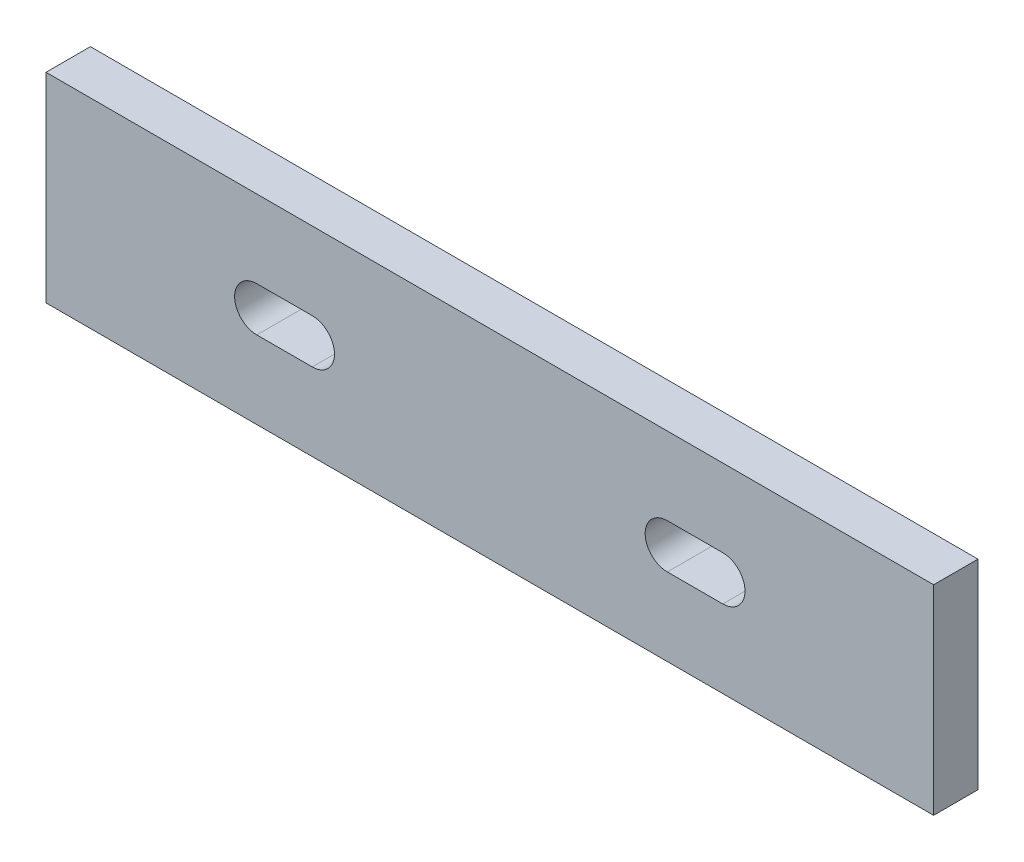
ISO-10303-21;
HEADER;
FILE_DESCRIPTION(('STEP AP214'),'2;1');
FILE_NAME('part.step','',(''),(''),'','','');
FILE_SCHEMA(('AUTOMOTIVE_DESIGN { 1 0 10303 214 1 1 1 1 }'));
ENDSEC;
DATA;
#1=APPLICATION_CONTEXT('core data for automotive mechanical design processes');
#2=APPLICATION_PROTOCOL_DEFINITION('international standard','automotive_design',2000,#1);
#3=PRODUCT_CONTEXT('',#1,'mechanical');
#4=PRODUCT('Part','Part','',(#3));
#5=PRODUCT_RELATED_PRODUCT_CATEGORY('part','',(#4));
#6=PRODUCT_DEFINITION_FORMATION('','',#4);
#7=PRODUCT_DEFINITION_CONTEXT('part definition',#1,'design');
#8=PRODUCT_DEFINITION('design','',#6,#7);
#9=PRODUCT_DEFINITION_SHAPE('','',#8);
#10=(LENGTH_UNIT() NAMED_UNIT(*) SI_UNIT(.MILLI.,.METRE.));
#11=(NAMED_UNIT(*) PLANE_ANGLE_UNIT() SI_UNIT($,.RADIAN.));
#12=(NAMED_UNIT(*) SI_UNIT($,.STERADIAN.) SOLID_ANGLE_UNIT());
#13=UNCERTAINTY_MEASURE_WITH_UNIT(LENGTH_MEASURE(1.E-05),#10,'distance_accuracy_value','');
#14=(GEOMETRIC_REPRESENTATION_CONTEXT(3) GLOBAL_UNCERTAINTY_ASSIGNED_CONTEXT((#13)) GLOBAL_UNIT_ASSIGNED_CONTEXT((#10,
#11,#12)) REPRESENTATION_CONTEXT('',''));
#15=CARTESIAN_POINT('',(0.,0.,0.));
#16=DIRECTION('',(0.,0.,1.));
#17=DIRECTION('',(1.,0.,0.));
#18=AXIS2_PLACEMENT_3D('',#15,#16,#17);
#19=CARTESIAN_POINT('',(0.,0.,20.));
#20=DIRECTION('',(0.,0.,-1.));
#21=DIRECTION('',(-1.,0.,0.));
#22=AXIS2_PLACEMENT_3D('',#19,#20,#21);
#23=PLANE('',#22);
#24=CARTESIAN_POINT('',(107.508250825083,-33.8778877887789,20.));
#25=DIRECTION('',(0.,0.,1.));
#26=DIRECTION('',(1.,0.,0.));
#27=AXIS2_PLACEMENT_3D('',#24,#25,#26);
#28=CIRCLE('',#27,10.);
#29=CARTESIAN_POINT('',(107.508250825083,-43.8778877887789,20.));
#30=VERTEX_POINT('',#29);
#31=CARTESIAN_POINT('',(107.508250825083,-23.8778877887789,20.));
#32=VERTEX_POINT('',#31);
#33=EDGE_CURVE('E159',#30,#32,#28,.T.);
#34=ORIENTED_EDGE('',*,*,#33,.F.);
#35=DIRECTION('',(1.,0.,0.));
#36=VECTOR('',#35,1.);
#37=CARTESIAN_POINT('',(107.508250825083,-43.8778877887789,20.));
#38=LINE('',#37,#36);
#39=CARTESIAN_POINT('',(82.5082508250826,-43.8778877887789,20.));
#40=VERTEX_POINT('',#39);
#41=EDGE_CURVE('E167',#40,#30,#38,.T.);
#42=ORIENTED_EDGE('',*,*,#41,.F.);
#43=CARTESIAN_POINT('',(82.5082508250826,-33.8778877887789,20.));
#44=DIRECTION('',(0.,0.,1.));
#45=DIRECTION('',(1.,0.,0.));
#46=AXIS2_PLACEMENT_3D('',#43,#44,#45);
#47=CIRCLE('',#46,10.);
#48=CARTESIAN_POINT('',(82.5082508250826,-23.8778877887789,20.));
#49=VERTEX_POINT('',#48);
#50=EDGE_CURVE('E164',#49,#40,#47,.T.);
#51=ORIENTED_EDGE('',*,*,#50,.F.);
#52=DIRECTION('',(-1.,0.,0.));
#53=VECTOR('',#52,1.);
#54=CARTESIAN_POINT('',(107.508250825083,-23.8778877887789,20.));
#55=LINE('',#54,#53);
#56=EDGE_CURVE('E161',#32,#49,#55,.T.);
#57=ORIENTED_EDGE('',*,*,#56,.F.);
#58=EDGE_LOOP('',(#34,#42,#51,#57));
#59=FACE_BOUND('',#58,.T.);
#60=DIRECTION('',(0.,1.,0.));
#61=VECTOR('',#60,1.);
#62=CARTESIAN_POINT('',(202.508250825083,11.1221122112211,20.));
#63=LINE('',#62,#61);
#64=CARTESIAN_POINT('',(202.508250825083,-78.8778877887789,20.));
#65=VERTEX_POINT('',#64);
#66=CARTESIAN_POINT('',(202.508250825083,11.1221122112211,20.));
#67=VERTEX_POINT('',#66);
#68=EDGE_CURVE('E190',#65,#67,#63,.T.);
#69=ORIENTED_EDGE('',*,*,#68,.T.);
#70=DIRECTION('',(-1.,0.,0.));
#71=VECTOR('',#70,1.);
#72=CARTESIAN_POINT('',(202.508250825083,11.1221122112211,20.));
#73=LINE('',#72,#71);
#74=CARTESIAN_POINT('',(-197.491749174917,11.122112211221,20.));
#75=VERTEX_POINT('',#74);
#76=EDGE_CURVE('E193',#67,#75,#73,.T.);
#77=ORIENTED_EDGE('',*,*,#76,.T.);
#78=DIRECTION('',(0.,-1.,0.));
#79=VECTOR('',#78,1.);
#80=CARTESIAN_POINT('',(-197.491749174917,11.122112211221,20.));
#81=LINE('',#80,#79);
#82=CARTESIAN_POINT('',(-197.491749174917,-78.8778877887789,20.));
#83=VERTEX_POINT('',#82);
#84=EDGE_CURVE('E196',#75,#83,#81,.T.);
#85=ORIENTED_EDGE('',*,*,#84,.T.);
#86=DIRECTION('',(1.,0.,0.));
#87=VECTOR('',#86,1.);
#88=CARTESIAN_POINT('',(202.508250825083,-78.8778877887789,20.));
#89=LINE('',#88,#87);
#90=EDGE_CURVE('E198',#83,#65,#89,.T.);
#91=ORIENTED_EDGE('',*,*,#90,.T.);
#92=EDGE_LOOP('',(#69,#77,#85,#91));
#93=FACE_BOUND('',#92,.T.);
#94=CARTESIAN_POINT('',(-77.4917491749174,-33.8778877887789,20.));
#95=DIRECTION('',(0.,0.,1.));
#96=DIRECTION('',(1.,0.,0.));
#97=AXIS2_PLACEMENT_3D('',#94,#95,#96);
#98=CIRCLE('',#97,10.);
#99=CARTESIAN_POINT('',(-77.4917491749174,-43.8778877887789,20.));
#100=VERTEX_POINT('',#99);
#101=CARTESIAN_POINT('',(-77.4917491749174,-23.8778877887789,20.));
#102=VERTEX_POINT('',#101);
#103=EDGE_CURVE('E123',#100,#102,#98,.T.);
#104=ORIENTED_EDGE('',*,*,#103,.F.);
#105=DIRECTION('',(1.,0.,0.));
#106=VECTOR('',#105,1.);
#107=CARTESIAN_POINT('',(-77.4917491749174,-43.8778877887789,20.));
#108=LINE('',#107,#106);
#109=CARTESIAN_POINT('',(-102.491749174917,-43.8778877887789,20.));
#110=VERTEX_POINT('',#109);
#111=EDGE_CURVE('E145',#110,#100,#108,.T.);
#112=ORIENTED_EDGE('',*,*,#111,.F.);
#113=CARTESIAN_POINT('',(-102.491749174917,-33.8778877887789,20.));
#114=DIRECTION('',(0.,0.,1.));
#115=DIRECTION('',(1.,0.,0.));
#116=AXIS2_PLACEMENT_3D('',#113,#114,#115);
#117=CIRCLE('',#116,9.99999999999999);
#118=CARTESIAN_POINT('',(-102.491749174917,-23.8778877887789,20.));
#119=VERTEX_POINT('',#118);
#120=EDGE_CURVE('E143',#119,#110,#117,.T.);
#121=ORIENTED_EDGE('',*,*,#120,.F.);
#122=DIRECTION('',(-1.,0.,0.));
#123=VECTOR('',#122,1.);
#124=CARTESIAN_POINT('',(-77.4917491749174,-23.8778877887789,20.));
#125=LINE('',#124,#123);
#126=EDGE_CURVE('E131',#102,#119,#125,.T.);
#127=ORIENTED_EDGE('',*,*,#126,.F.);
#128=EDGE_LOOP('',(#104,#112,#121,#127));
#129=FACE_BOUND('',#128,.T.);
#130=ADVANCED_FACE('F34',(#59,#93,#129),#23,.F.);
#131=CARTESIAN_POINT('',(0.,0.,0.));
#132=DIRECTION('',(0.,0.,-1.));
#133=DIRECTION('',(-1.,0.,0.));
#134=AXIS2_PLACEMENT_3D('',#131,#132,#133);
#135=PLANE('',#134);
#136=DIRECTION('',(0.,1.,0.));
#137=VECTOR('',#136,1.);
#138=CARTESIAN_POINT('',(202.508250825083,11.1221122112211,0.));
#139=LINE('',#138,#137);
#140=CARTESIAN_POINT('',(202.508250825083,-78.8778877887789,0.));
#141=VERTEX_POINT('',#140);
#142=CARTESIAN_POINT('',(202.508250825083,11.1221122112211,0.));
#143=VERTEX_POINT('',#142);
#144=EDGE_CURVE('E189',#141,#143,#139,.T.);
#145=ORIENTED_EDGE('',*,*,#144,.F.);
#146=DIRECTION('',(1.,0.,0.));
#147=VECTOR('',#146,1.);
#148=CARTESIAN_POINT('',(202.508250825083,-78.8778877887789,0.));
#149=LINE('',#148,#147);
#150=CARTESIAN_POINT('',(-197.491749174917,-78.8778877887789,0.));
#151=VERTEX_POINT('',#150);
#152=EDGE_CURVE('E194',#151,#141,#149,.T.);
#153=ORIENTED_EDGE('',*,*,#152,.F.);
#154=DIRECTION('',(0.,-1.,0.));
#155=VECTOR('',#154,1.);
#156=CARTESIAN_POINT('',(-197.491749174917,11.122112211221,0.));
#157=LINE('',#156,#155);
#158=CARTESIAN_POINT('',(-197.491749174917,11.122112211221,0.));
#159=VERTEX_POINT('',#158);
#160=EDGE_CURVE('E205',#159,#151,#157,.T.);
#161=ORIENTED_EDGE('',*,*,#160,.F.);
#162=DIRECTION('',(-1.,0.,0.));
#163=VECTOR('',#162,1.);
#164=CARTESIAN_POINT('',(202.508250825083,11.1221122112211,0.));
#165=LINE('',#164,#163);
#166=EDGE_CURVE('E203',#143,#159,#165,.T.);
#167=ORIENTED_EDGE('',*,*,#166,.F.);
#168=EDGE_LOOP('',(#145,#153,#161,#167));
#169=FACE_BOUND('',#168,.T.);
#170=DIRECTION('',(1.,0.,0.));
#171=VECTOR('',#170,1.);
#172=CARTESIAN_POINT('',(107.508250825083,-43.8778877887789,0.));
#173=LINE('',#172,#171);
#174=CARTESIAN_POINT('',(82.5082508250826,-43.8778877887789,0.));
#175=VERTEX_POINT('',#174);
#176=CARTESIAN_POINT('',(107.508250825083,-43.8778877887789,0.));
#177=VERTEX_POINT('',#176);
#178=EDGE_CURVE('E162',#175,#177,#173,.T.);
#179=ORIENTED_EDGE('',*,*,#178,.T.);
#180=CARTESIAN_POINT('',(107.508250825083,-33.8778877887789,0.));
#181=DIRECTION('',(0.,0.,1.));
#182=DIRECTION('',(1.,0.,0.));
#183=AXIS2_PLACEMENT_3D('',#180,#181,#182);
#184=CIRCLE('',#183,10.);
#185=CARTESIAN_POINT('',(107.508250825083,-23.8778877887789,0.));
#186=VERTEX_POINT('',#185);
#187=EDGE_CURVE('E139',#177,#186,#184,.T.);
#188=ORIENTED_EDGE('',*,*,#187,.T.);
#189=DIRECTION('',(-1.,0.,0.));
#190=VECTOR('',#189,1.);
#191=CARTESIAN_POINT('',(107.508250825083,-23.8778877887789,0.));
#192=LINE('',#191,#190);
#193=CARTESIAN_POINT('',(82.5082508250826,-23.8778877887789,0.));
#194=VERTEX_POINT('',#193);
#195=EDGE_CURVE('E172',#186,#194,#192,.T.);
#196=ORIENTED_EDGE('',*,*,#195,.T.);
#197=CARTESIAN_POINT('',(82.5082508250826,-33.8778877887789,0.));
#198=DIRECTION('',(0.,0.,1.));
#199=DIRECTION('',(1.,0.,0.));
#200=AXIS2_PLACEMENT_3D('',#197,#198,#199);
#201=CIRCLE('',#200,10.);
#202=EDGE_CURVE('E175',#194,#175,#201,.T.);
#203=ORIENTED_EDGE('',*,*,#202,.T.);
#204=EDGE_LOOP('',(#179,#188,#196,#203));
#205=FACE_BOUND('',#204,.T.);
#206=DIRECTION('',(1.,0.,0.));
#207=VECTOR('',#206,1.);
#208=CARTESIAN_POINT('',(-77.4917491749174,-43.8778877887789,0.));
#209=LINE('',#208,#207);
#210=CARTESIAN_POINT('',(-102.491749174917,-43.8778877887789,0.));
#211=VERTEX_POINT('',#210);
#212=CARTESIAN_POINT('',(-77.4917491749174,-43.8778877887789,0.));
#213=VERTEX_POINT('',#212);
#214=EDGE_CURVE('E132',#211,#213,#209,.T.);
#215=ORIENTED_EDGE('',*,*,#214,.T.);
#216=CARTESIAN_POINT('',(-77.4917491749174,-33.8778877887789,0.));
#217=DIRECTION('',(0.,0.,1.));
#218=DIRECTION('',(1.,0.,0.));
#219=AXIS2_PLACEMENT_3D('',#216,#217,#218);
#220=CIRCLE('',#219,10.);
#221=CARTESIAN_POINT('',(-77.4917491749174,-23.8778877887789,0.));
#222=VERTEX_POINT('',#221);
#223=EDGE_CURVE('E57',#213,#222,#220,.T.);
#224=ORIENTED_EDGE('',*,*,#223,.T.);
#225=DIRECTION('',(-1.,0.,0.));
#226=VECTOR('',#225,1.);
#227=CARTESIAN_POINT('',(-77.4917491749174,-23.8778877887789,0.));
#228=LINE('',#227,#226);
#229=CARTESIAN_POINT('',(-102.491749174917,-23.8778877887789,0.));
#230=VERTEX_POINT('',#229);
#231=EDGE_CURVE('E138',#222,#230,#228,.T.);
#232=ORIENTED_EDGE('',*,*,#231,.T.);
#233=CARTESIAN_POINT('',(-102.491749174917,-33.8778877887789,0.));
#234=DIRECTION('',(0.,0.,1.));
#235=DIRECTION('',(1.,0.,0.));
#236=AXIS2_PLACEMENT_3D('',#233,#234,#235);
#237=CIRCLE('',#236,9.99999999999999);
#238=EDGE_CURVE('E151',#230,#211,#237,.T.);
#239=ORIENTED_EDGE('',*,*,#238,.T.);
#240=EDGE_LOOP('',(#215,#224,#232,#239));
#241=FACE_BOUND('',#240,.T.);
#242=ADVANCED_FACE('F223',(#169,#205,#241),#135,.T.);
#243=CARTESIAN_POINT('',(202.508250825083,11.1221122112211,20.));
#244=DIRECTION('',(-1.,0.,0.));
#245=DIRECTION('',(0.,0.,1.));
#246=AXIS2_PLACEMENT_3D('',#243,#244,#245);
#247=PLANE('',#246);
#248=ORIENTED_EDGE('',*,*,#144,.T.);
#249=DIRECTION('',(0.,0.,-1.));
#250=VECTOR('',#249,1.);
#251=CARTESIAN_POINT('',(202.508250825083,11.1221122112211,20.));
#252=LINE('',#251,#250);
#253=EDGE_CURVE('E11',#67,#143,#252,.T.);
#254=ORIENTED_EDGE('',*,*,#253,.F.);
#255=ORIENTED_EDGE('',*,*,#68,.F.);
#256=DIRECTION('',(0.,0.,-1.));
#257=VECTOR('',#256,1.);
#258=CARTESIAN_POINT('',(202.508250825083,-78.8778877887789,20.));
#259=LINE('',#258,#257);
#260=EDGE_CURVE('E200',#65,#141,#259,.T.);
#261=ORIENTED_EDGE('',*,*,#260,.T.);
#262=EDGE_LOOP('',(#248,#254,#255,#261));
#263=FACE_BOUND('',#262,.T.);
#264=ADVANCED_FACE('F36',(#263),#247,.F.);
#265=CARTESIAN_POINT('',(202.508250825083,11.1221122112211,20.));
#266=DIRECTION('',(0.,-1.,0.));
#267=DIRECTION('',(1.,0.,0.));
#268=AXIS2_PLACEMENT_3D('',#265,#266,#267);
#269=PLANE('',#268);
#270=ORIENTED_EDGE('',*,*,#166,.T.);
#271=DIRECTION('',(0.,0.,-1.));
#272=VECTOR('',#271,1.);
#273=CARTESIAN_POINT('',(-197.491749174917,11.122112211221,20.));
#274=LINE('',#273,#272);
#275=EDGE_CURVE('E42',#75,#159,#274,.T.);
#276=ORIENTED_EDGE('',*,*,#275,.F.);
#277=ORIENTED_EDGE('',*,*,#76,.F.);
#278=ORIENTED_EDGE('',*,*,#253,.T.);
#279=EDGE_LOOP('',(#270,#276,#277,#278));
#280=FACE_BOUND('',#279,.T.);
#281=ADVANCED_FACE('F233',(#280),#269,.F.);
#282=CARTESIAN_POINT('',(-197.491749174917,11.122112211221,20.));
#283=DIRECTION('',(1.,0.,0.));
#284=DIRECTION('',(0.,1.,0.));
#285=AXIS2_PLACEMENT_3D('',#282,#283,#284);
#286=PLANE('',#285);
#287=ORIENTED_EDGE('',*,*,#160,.T.);
#288=DIRECTION('',(0.,0.,-1.));
#289=VECTOR('',#288,1.);
#290=CARTESIAN_POINT('',(-197.491749174917,-78.8778877887789,20.));
#291=LINE('',#290,#289);
#292=EDGE_CURVE('E210',#83,#151,#291,.T.);
#293=ORIENTED_EDGE('',*,*,#292,.F.);
#294=ORIENTED_EDGE('',*,*,#84,.F.);
#295=ORIENTED_EDGE('',*,*,#275,.T.);
#296=EDGE_LOOP('',(#287,#293,#294,#295));
#297=FACE_BOUND('',#296,.T.);
#298=ADVANCED_FACE('F217',(#297),#286,.F.);
#299=CARTESIAN_POINT('',(202.508250825083,-78.8778877887789,20.));
#300=DIRECTION('',(0.,1.,0.));
#301=DIRECTION('',(-1.,0.,0.));
#302=AXIS2_PLACEMENT_3D('',#299,#300,#301);
#303=PLANE('',#302);
#304=ORIENTED_EDGE('',*,*,#152,.T.);
#305=ORIENTED_EDGE('',*,*,#260,.F.);
#306=ORIENTED_EDGE('',*,*,#90,.F.);
#307=ORIENTED_EDGE('',*,*,#292,.T.);
#308=EDGE_LOOP('',(#304,#305,#306,#307));
#309=FACE_BOUND('',#308,.T.);
#310=ADVANCED_FACE('F227',(#309),#303,.F.);
#311=CARTESIAN_POINT('',(107.508250825083,-33.8778877887789,20.));
#312=DIRECTION('',(0.,0.,-1.));
#313=DIRECTION('',(-1.,0.,0.));
#314=AXIS2_PLACEMENT_3D('',#311,#312,#313);
#315=CYLINDRICAL_SURFACE('',#314,10.);
#316=ORIENTED_EDGE('',*,*,#187,.F.);
#317=DIRECTION('',(0.,0.,-1.));
#318=VECTOR('',#317,1.);
#319=CARTESIAN_POINT('',(107.508250825083,-43.8778877887789,20.));
#320=LINE('',#319,#318);
#321=EDGE_CURVE('E169',#30,#177,#320,.T.);
#322=ORIENTED_EDGE('',*,*,#321,.F.);
#323=ORIENTED_EDGE('',*,*,#33,.T.);
#324=DIRECTION('',(0.,0.,-1.));
#325=VECTOR('',#324,1.);
#326=CARTESIAN_POINT('',(107.508250825083,-23.8778877887789,20.));
#327=LINE('',#326,#325);
#328=EDGE_CURVE('E186',#32,#186,#327,.T.);
#329=ORIENTED_EDGE('',*,*,#328,.T.);
#330=EDGE_LOOP('',(#316,#322,#323,#329));
#331=FACE_BOUND('',#330,.T.);
#332=ADVANCED_FACE('F249',(#331),#315,.F.);
#333=CARTESIAN_POINT('',(107.508250825083,-23.8778877887789,20.));
#334=DIRECTION('',(0.,-1.,0.));
#335=DIRECTION('',(1.,0.,0.));
#336=AXIS2_PLACEMENT_3D('',#333,#334,#335);
#337=PLANE('',#336);
#338=ORIENTED_EDGE('',*,*,#195,.F.);
#339=ORIENTED_EDGE('',*,*,#328,.F.);
#340=ORIENTED_EDGE('',*,*,#56,.T.);
#341=DIRECTION('',(0.,0.,-1.));
#342=VECTOR('',#341,1.);
#343=CARTESIAN_POINT('',(82.5082508250826,-23.8778877887789,20.));
#344=LINE('',#343,#342);
#345=EDGE_CURVE('E184',#49,#194,#344,.T.);
#346=ORIENTED_EDGE('',*,*,#345,.T.);
#347=EDGE_LOOP('',(#338,#339,#340,#346));
#348=FACE_BOUND('',#347,.T.);
#349=ADVANCED_FACE('F256',(#348),#337,.T.);
#350=CARTESIAN_POINT('',(82.5082508250826,-33.8778877887789,20.));
#351=DIRECTION('',(0.,0.,-1.));
#352=DIRECTION('',(-1.,0.,0.));
#353=AXIS2_PLACEMENT_3D('',#350,#351,#352);
#354=CYLINDRICAL_SURFACE('',#353,10.);
#355=ORIENTED_EDGE('',*,*,#202,.F.);
#356=ORIENTED_EDGE('',*,*,#345,.F.);
#357=ORIENTED_EDGE('',*,*,#50,.T.);
#358=DIRECTION('',(0.,0.,-1.));
#359=VECTOR('',#358,1.);
#360=CARTESIAN_POINT('',(82.5082508250826,-43.8778877887789,20.));
#361=LINE('',#360,#359);
#362=EDGE_CURVE('E182',#40,#175,#361,.T.);
#363=ORIENTED_EDGE('',*,*,#362,.T.);
#364=EDGE_LOOP('',(#355,#356,#357,#363));
#365=FACE_BOUND('',#364,.T.);
#366=ADVANCED_FACE('F261',(#365),#354,.F.);
#367=CARTESIAN_POINT('',(107.508250825083,-43.8778877887789,20.));
#368=DIRECTION('',(0.,1.,0.));
#369=DIRECTION('',(-1.,0.,0.));
#370=AXIS2_PLACEMENT_3D('',#367,#368,#369);
#371=PLANE('',#370);
#372=ORIENTED_EDGE('',*,*,#178,.F.);
#373=ORIENTED_EDGE('',*,*,#362,.F.);
#374=ORIENTED_EDGE('',*,*,#41,.T.);
#375=ORIENTED_EDGE('',*,*,#321,.T.);
#376=EDGE_LOOP('',(#372,#373,#374,#375));
#377=FACE_BOUND('',#376,.T.);
#378=ADVANCED_FACE('F267',(#377),#371,.T.);
#379=CARTESIAN_POINT('',(-77.4917491749174,-33.8778877887789,20.));
#380=DIRECTION('',(0.,0.,-1.));
#381=DIRECTION('',(-1.,0.,0.));
#382=AXIS2_PLACEMENT_3D('',#379,#380,#381);
#383=CYLINDRICAL_SURFACE('',#382,10.);
#384=ORIENTED_EDGE('',*,*,#223,.F.);
#385=DIRECTION('',(0.,0.,-1.));
#386=VECTOR('',#385,1.);
#387=CARTESIAN_POINT('',(-77.4917491749174,-43.8778877887789,20.));
#388=LINE('',#387,#386);
#389=EDGE_CURVE('E127',#100,#213,#388,.T.);
#390=ORIENTED_EDGE('',*,*,#389,.F.);
#391=ORIENTED_EDGE('',*,*,#103,.T.);
#392=DIRECTION('',(0.,0.,-1.));
#393=VECTOR('',#392,1.);
#394=CARTESIAN_POINT('',(-77.4917491749174,-23.8778877887789,20.));
#395=LINE('',#394,#393);
#396=EDGE_CURVE('E126',#102,#222,#395,.T.);
#397=ORIENTED_EDGE('',*,*,#396,.T.);
#398=EDGE_LOOP('',(#384,#390,#391,#397));
#399=FACE_BOUND('',#398,.T.);
#400=ADVANCED_FACE('F125',(#399),#383,.F.);
#401=CARTESIAN_POINT('',(-77.4917491749174,-23.8778877887789,20.));
#402=DIRECTION('',(0.,-1.,0.));
#403=DIRECTION('',(1.,0.,0.));
#404=AXIS2_PLACEMENT_3D('',#401,#402,#403);
#405=PLANE('',#404);
#406=ORIENTED_EDGE('',*,*,#231,.F.);
#407=ORIENTED_EDGE('',*,*,#396,.F.);
#408=ORIENTED_EDGE('',*,*,#126,.T.);
#409=DIRECTION('',(0.,0.,-1.));
#410=VECTOR('',#409,1.);
#411=CARTESIAN_POINT('',(-102.491749174917,-23.8778877887789,20.));
#412=LINE('',#411,#410);
#413=EDGE_CURVE('E140',#119,#230,#412,.T.);
#414=ORIENTED_EDGE('',*,*,#413,.T.);
#415=EDGE_LOOP('',(#406,#407,#408,#414));
#416=FACE_BOUND('',#415,.T.);
#417=ADVANCED_FACE('F135',(#416),#405,.T.);
#418=CARTESIAN_POINT('',(-102.491749174917,-33.8778877887789,20.));
#419=DIRECTION('',(0.,0.,-1.));
#420=DIRECTION('',(-1.,0.,0.));
#421=AXIS2_PLACEMENT_3D('',#418,#419,#420);
#422=CYLINDRICAL_SURFACE('',#421,9.99999999999999);
#423=ORIENTED_EDGE('',*,*,#238,.F.);
#424=ORIENTED_EDGE('',*,*,#413,.F.);
#425=ORIENTED_EDGE('',*,*,#120,.T.);
#426=DIRECTION('',(0.,0.,-1.));
#427=VECTOR('',#426,1.);
#428=CARTESIAN_POINT('',(-102.491749174917,-43.8778877887789,20.));
#429=LINE('',#428,#427);
#430=EDGE_CURVE('E49',#110,#211,#429,.T.);
#431=ORIENTED_EDGE('',*,*,#430,.T.);
#432=EDGE_LOOP('',(#423,#424,#425,#431));
#433=FACE_BOUND('',#432,.T.);
#434=ADVANCED_FACE('F286',(#433),#422,.F.);
#435=CARTESIAN_POINT('',(-77.4917491749174,-43.8778877887789,20.));
#436=DIRECTION('',(0.,1.,0.));
#437=DIRECTION('',(-1.,0.,0.));
#438=AXIS2_PLACEMENT_3D('',#435,#436,#437);
#439=PLANE('',#438);
#440=ORIENTED_EDGE('',*,*,#214,.F.);
#441=ORIENTED_EDGE('',*,*,#430,.F.);
#442=ORIENTED_EDGE('',*,*,#111,.T.);
#443=ORIENTED_EDGE('',*,*,#389,.T.);
#444=EDGE_LOOP('',(#440,#441,#442,#443));
#445=FACE_BOUND('',#444,.T.);
#446=ADVANCED_FACE('F289',(#445),#439,.T.);
#447=CLOSED_SHELL('',(#130,#242,#264,#281,#298,#310,#332,#349,#366,#378,#400,#417,#434,#446));
#448=MANIFOLD_SOLID_BREP('B2',#447);
#449=ADVANCED_BREP_SHAPE_REPRESENTATION('',(#18,#448),#14);
#450=SHAPE_DEFINITION_REPRESENTATION(#9,#449);
ENDSEC;
END-ISO-10303-21;
